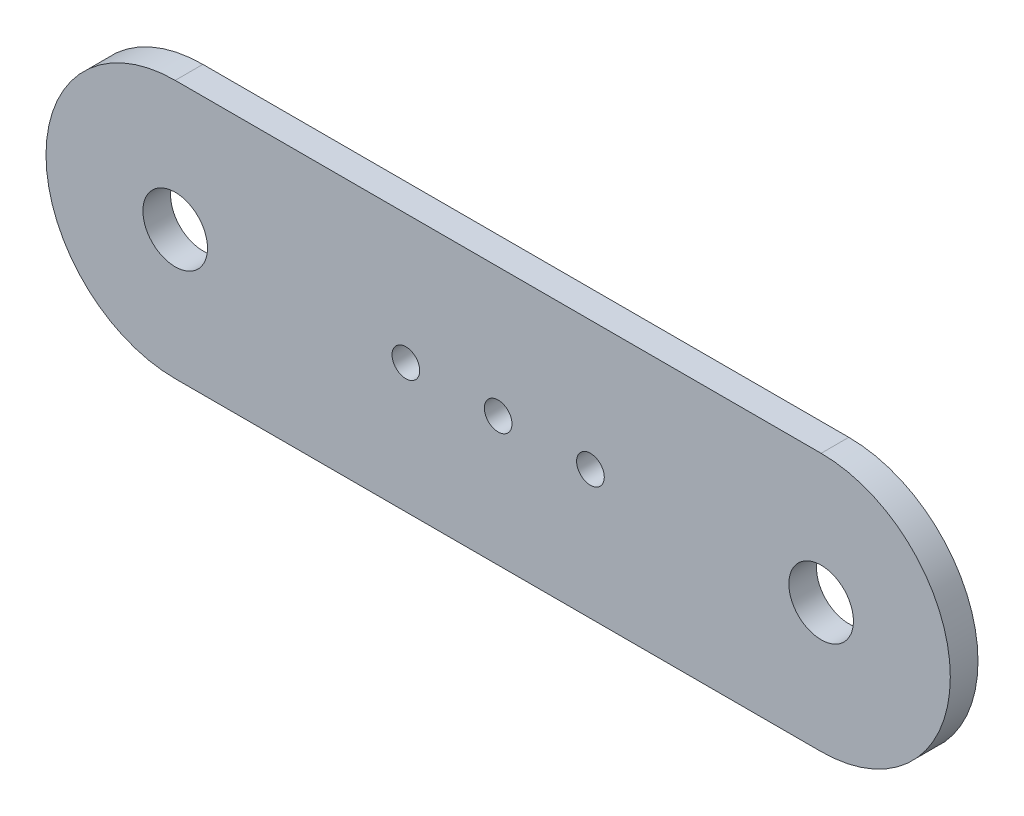
ISO-10303-21;
HEADER;
FILE_DESCRIPTION(('STEP AP214'),'2;1');
FILE_NAME('part.step','',(''),(''),'','','');
FILE_SCHEMA(('AUTOMOTIVE_DESIGN { 1 0 10303 214 1 1 1 1 }'));
ENDSEC;
DATA;
#1=APPLICATION_CONTEXT('core data for automotive mechanical design processes');
#2=APPLICATION_PROTOCOL_DEFINITION('international standard','automotive_design',2000,#1);
#3=PRODUCT_CONTEXT('',#1,'mechanical');
#4=PRODUCT('Part','Part','',(#3));
#5=PRODUCT_RELATED_PRODUCT_CATEGORY('part','',(#4));
#6=PRODUCT_DEFINITION_FORMATION('','',#4);
#7=PRODUCT_DEFINITION_CONTEXT('part definition',#1,'design');
#8=PRODUCT_DEFINITION('design','',#6,#7);
#9=PRODUCT_DEFINITION_SHAPE('','',#8);
#10=(LENGTH_UNIT() NAMED_UNIT(*) SI_UNIT(.MILLI.,.METRE.));
#11=(NAMED_UNIT(*) PLANE_ANGLE_UNIT() SI_UNIT($,.RADIAN.));
#12=(NAMED_UNIT(*) SI_UNIT($,.STERADIAN.) SOLID_ANGLE_UNIT());
#13=UNCERTAINTY_MEASURE_WITH_UNIT(LENGTH_MEASURE(1.E-05),#10,'distance_accuracy_value','');
#14=(GEOMETRIC_REPRESENTATION_CONTEXT(3) GLOBAL_UNCERTAINTY_ASSIGNED_CONTEXT((#13)) GLOBAL_UNIT_ASSIGNED_CONTEXT((#10,
#11,#12)) REPRESENTATION_CONTEXT('',''));
#15=CARTESIAN_POINT('',(0.,0.,0.));
#16=DIRECTION('',(0.,0.,1.));
#17=DIRECTION('',(1.,0.,0.));
#18=AXIS2_PLACEMENT_3D('',#15,#16,#17);
#19=CARTESIAN_POINT('',(0.,0.,3.));
#20=DIRECTION('',(0.,0.,1.));
#21=DIRECTION('',(1.,0.,0.));
#22=AXIS2_PLACEMENT_3D('',#19,#20,#21);
#23=PLANE('',#22);
#24=CARTESIAN_POINT('',(34.9999999999983,0.,3.));
#25=DIRECTION('',(0.,0.,1.));
#26=DIRECTION('',(1.,0.,0.));
#27=AXIS2_PLACEMENT_3D('',#24,#25,#26);
#28=CIRCLE('',#27,1.5);
#29=CARTESIAN_POINT('',(36.4999999999983,0.,3.));
#30=VERTEX_POINT('',#29);
#31=EDGE_CURVE('E129',#30,#30,#28,.T.);
#32=ORIENTED_EDGE('',*,*,#31,.F.);
#33=EDGE_LOOP('',(#32));
#34=FACE_BOUND('',#33,.T.);
#35=CARTESIAN_POINT('',(25.0000000000028,0.,3.));
#36=DIRECTION('',(0.,0.,1.));
#37=DIRECTION('',(1.,0.,0.));
#38=AXIS2_PLACEMENT_3D('',#35,#36,#37);
#39=CIRCLE('',#38,1.5);
#40=CARTESIAN_POINT('',(26.5000000000028,0.,3.));
#41=VERTEX_POINT('',#40);
#42=EDGE_CURVE('E117',#41,#41,#39,.T.);
#43=ORIENTED_EDGE('',*,*,#42,.F.);
#44=EDGE_LOOP('',(#43));
#45=FACE_BOUND('',#44,.T.);
#46=CARTESIAN_POINT('',(0.,0.,3.));
#47=DIRECTION('',(0.,0.,1.));
#48=DIRECTION('',(1.,0.,0.));
#49=AXIS2_PLACEMENT_3D('',#46,#47,#48);
#50=CIRCLE('',#49,14.);
#51=CARTESIAN_POINT('',(0.,14.,3.));
#52=VERTEX_POINT('',#51);
#53=CARTESIAN_POINT('',(0.,-14.,3.));
#54=VERTEX_POINT('',#53);
#55=EDGE_CURVE('E87',#52,#54,#50,.T.);
#56=ORIENTED_EDGE('',*,*,#55,.T.);
#57=DIRECTION('',(1.,0.,0.));
#58=VECTOR('',#57,1.);
#59=CARTESIAN_POINT('',(0.,-14.,3.));
#60=LINE('',#59,#58);
#61=CARTESIAN_POINT('',(70.,-14.,3.));
#62=VERTEX_POINT('',#61);
#63=EDGE_CURVE('E82',#54,#62,#60,.T.);
#64=ORIENTED_EDGE('',*,*,#63,.T.);
#65=CARTESIAN_POINT('',(70.,0.,3.));
#66=DIRECTION('',(0.,0.,1.));
#67=DIRECTION('',(1.,0.,0.));
#68=AXIS2_PLACEMENT_3D('',#65,#66,#67);
#69=CIRCLE('',#68,14.);
#70=CARTESIAN_POINT('',(70.,14.,3.));
#71=VERTEX_POINT('',#70);
#72=EDGE_CURVE('E85',#62,#71,#69,.T.);
#73=ORIENTED_EDGE('',*,*,#72,.T.);
#74=DIRECTION('',(-1.,0.,0.));
#75=VECTOR('',#74,1.);
#76=CARTESIAN_POINT('',(0.,14.,3.));
#77=LINE('',#76,#75);
#78=EDGE_CURVE('E52',#71,#52,#77,.T.);
#79=ORIENTED_EDGE('',*,*,#78,.T.);
#80=EDGE_LOOP('',(#56,#64,#73,#79));
#81=FACE_BOUND('',#80,.T.);
#82=CARTESIAN_POINT('',(0.,0.,3.));
#83=DIRECTION('',(0.,0.,1.));
#84=DIRECTION('',(1.,0.,0.));
#85=AXIS2_PLACEMENT_3D('',#82,#83,#84);
#86=CIRCLE('',#85,3.5);
#87=CARTESIAN_POINT('',(3.5,0.,3.));
#88=VERTEX_POINT('',#87);
#89=EDGE_CURVE('E102',#88,#88,#86,.T.);
#90=ORIENTED_EDGE('',*,*,#89,.F.);
#91=EDGE_LOOP('',(#90));
#92=FACE_BOUND('',#91,.T.);
#93=CARTESIAN_POINT('',(70.,0.,3.));
#94=DIRECTION('',(0.,0.,1.));
#95=DIRECTION('',(1.,0.,0.));
#96=AXIS2_PLACEMENT_3D('',#93,#94,#95);
#97=CIRCLE('',#96,3.50000000000001);
#98=CARTESIAN_POINT('',(73.5,0.,3.));
#99=VERTEX_POINT('',#98);
#100=EDGE_CURVE('E123',#99,#99,#97,.T.);
#101=ORIENTED_EDGE('',*,*,#100,.F.);
#102=EDGE_LOOP('',(#101));
#103=FACE_BOUND('',#102,.T.);
#104=CARTESIAN_POINT('',(44.9999999999938,0.,3.));
#105=DIRECTION('',(0.,0.,1.));
#106=DIRECTION('',(1.,0.,0.));
#107=AXIS2_PLACEMENT_3D('',#104,#105,#106);
#108=CIRCLE('',#107,1.5);
#109=CARTESIAN_POINT('',(46.4999999999938,0.,3.));
#110=VERTEX_POINT('',#109);
#111=EDGE_CURVE('E135',#110,#110,#108,.T.);
#112=ORIENTED_EDGE('',*,*,#111,.F.);
#113=EDGE_LOOP('',(#112));
#114=FACE_BOUND('',#113,.T.);
#115=ADVANCED_FACE('F35',(#34,#45,#81,#92,#103,#114),#23,.T.);
#116=CARTESIAN_POINT('',(0.,0.,0.));
#117=DIRECTION('',(0.,0.,1.));
#118=DIRECTION('',(1.,0.,0.));
#119=AXIS2_PLACEMENT_3D('',#116,#117,#118);
#120=PLANE('',#119);
#121=CARTESIAN_POINT('',(34.9999999999983,0.,0.));
#122=DIRECTION('',(0.,0.,1.));
#123=DIRECTION('',(1.,0.,0.));
#124=AXIS2_PLACEMENT_3D('',#121,#122,#123);
#125=CIRCLE('',#124,1.5);
#126=CARTESIAN_POINT('',(36.4999999999983,0.,0.));
#127=VERTEX_POINT('',#126);
#128=EDGE_CURVE('E132',#127,#127,#125,.T.);
#129=ORIENTED_EDGE('',*,*,#128,.T.);
#130=EDGE_LOOP('',(#129));
#131=FACE_BOUND('',#130,.T.);
#132=CARTESIAN_POINT('',(25.0000000000028,0.,0.));
#133=DIRECTION('',(0.,0.,1.));
#134=DIRECTION('',(1.,0.,0.));
#135=AXIS2_PLACEMENT_3D('',#132,#133,#134);
#136=CIRCLE('',#135,1.5);
#137=CARTESIAN_POINT('',(26.5000000000028,0.,0.));
#138=VERTEX_POINT('',#137);
#139=EDGE_CURVE('E120',#138,#138,#136,.T.);
#140=ORIENTED_EDGE('',*,*,#139,.T.);
#141=EDGE_LOOP('',(#140));
#142=FACE_BOUND('',#141,.T.);
#143=CARTESIAN_POINT('',(0.,0.,0.));
#144=DIRECTION('',(0.,0.,1.));
#145=DIRECTION('',(1.,0.,0.));
#146=AXIS2_PLACEMENT_3D('',#143,#144,#145);
#147=CIRCLE('',#146,14.);
#148=CARTESIAN_POINT('',(0.,14.,0.));
#149=VERTEX_POINT('',#148);
#150=CARTESIAN_POINT('',(0.,-14.,0.));
#151=VERTEX_POINT('',#150);
#152=EDGE_CURVE('E99',#149,#151,#147,.T.);
#153=ORIENTED_EDGE('',*,*,#152,.F.);
#154=DIRECTION('',(-1.,0.,0.));
#155=VECTOR('',#154,1.);
#156=CARTESIAN_POINT('',(0.,14.,0.));
#157=LINE('',#156,#155);
#158=CARTESIAN_POINT('',(70.,14.,0.));
#159=VERTEX_POINT('',#158);
#160=EDGE_CURVE('E75',#159,#149,#157,.T.);
#161=ORIENTED_EDGE('',*,*,#160,.F.);
#162=CARTESIAN_POINT('',(70.,0.,0.));
#163=DIRECTION('',(0.,0.,1.));
#164=DIRECTION('',(1.,0.,0.));
#165=AXIS2_PLACEMENT_3D('',#162,#163,#164);
#166=CIRCLE('',#165,14.);
#167=CARTESIAN_POINT('',(70.,-14.,0.));
#168=VERTEX_POINT('',#167);
#169=EDGE_CURVE('E69',#168,#159,#166,.T.);
#170=ORIENTED_EDGE('',*,*,#169,.F.);
#171=DIRECTION('',(1.,0.,0.));
#172=VECTOR('',#171,1.);
#173=CARTESIAN_POINT('',(0.,-14.,0.));
#174=LINE('',#173,#172);
#175=EDGE_CURVE('E91',#151,#168,#174,.T.);
#176=ORIENTED_EDGE('',*,*,#175,.F.);
#177=EDGE_LOOP('',(#153,#161,#170,#176));
#178=FACE_BOUND('',#177,.T.);
#179=CARTESIAN_POINT('',(0.,0.,0.));
#180=DIRECTION('',(0.,0.,1.));
#181=DIRECTION('',(1.,0.,0.));
#182=AXIS2_PLACEMENT_3D('',#179,#180,#181);
#183=CIRCLE('',#182,3.5);
#184=CARTESIAN_POINT('',(3.5,0.,0.));
#185=VERTEX_POINT('',#184);
#186=EDGE_CURVE('E114',#185,#185,#183,.T.);
#187=ORIENTED_EDGE('',*,*,#186,.T.);
#188=EDGE_LOOP('',(#187));
#189=FACE_BOUND('',#188,.T.);
#190=CARTESIAN_POINT('',(70.,0.,0.));
#191=DIRECTION('',(0.,0.,1.));
#192=DIRECTION('',(1.,0.,0.));
#193=AXIS2_PLACEMENT_3D('',#190,#191,#192);
#194=CIRCLE('',#193,3.50000000000001);
#195=CARTESIAN_POINT('',(73.5,0.,0.));
#196=VERTEX_POINT('',#195);
#197=EDGE_CURVE('E126',#196,#196,#194,.T.);
#198=ORIENTED_EDGE('',*,*,#197,.T.);
#199=EDGE_LOOP('',(#198));
#200=FACE_BOUND('',#199,.T.);
#201=CARTESIAN_POINT('',(44.9999999999938,0.,0.));
#202=DIRECTION('',(0.,0.,1.));
#203=DIRECTION('',(1.,0.,0.));
#204=AXIS2_PLACEMENT_3D('',#201,#202,#203);
#205=CIRCLE('',#204,1.5);
#206=CARTESIAN_POINT('',(46.4999999999938,0.,0.));
#207=VERTEX_POINT('',#206);
#208=EDGE_CURVE('E138',#207,#207,#205,.T.);
#209=ORIENTED_EDGE('',*,*,#208,.T.);
#210=EDGE_LOOP('',(#209));
#211=FACE_BOUND('',#210,.T.);
#212=ADVANCED_FACE('F110',(#131,#142,#178,#189,#200,#211),#120,.F.);
#213=CARTESIAN_POINT('',(0.,0.,3.));
#214=DIRECTION('',(0.,0.,-1.));
#215=DIRECTION('',(-1.,0.,0.));
#216=AXIS2_PLACEMENT_3D('',#213,#214,#215);
#217=CYLINDRICAL_SURFACE('',#216,14.);
#218=ORIENTED_EDGE('',*,*,#152,.T.);
#219=DIRECTION('',(0.,0.,-1.));
#220=VECTOR('',#219,1.);
#221=CARTESIAN_POINT('',(0.,-14.,3.));
#222=LINE('',#221,#220);
#223=EDGE_CURVE('E11',#54,#151,#222,.T.);
#224=ORIENTED_EDGE('',*,*,#223,.F.);
#225=ORIENTED_EDGE('',*,*,#55,.F.);
#226=DIRECTION('',(0.,0.,-1.));
#227=VECTOR('',#226,1.);
#228=CARTESIAN_POINT('',(0.,14.,3.));
#229=LINE('',#228,#227);
#230=EDGE_CURVE('E95',#52,#149,#229,.T.);
#231=ORIENTED_EDGE('',*,*,#230,.T.);
#232=EDGE_LOOP('',(#218,#224,#225,#231));
#233=FACE_BOUND('',#232,.T.);
#234=ADVANCED_FACE('F37',(#233),#217,.T.);
#235=CARTESIAN_POINT('',(0.,-14.,3.));
#236=DIRECTION('',(0.,1.,0.));
#237=DIRECTION('',(0.,0.,1.));
#238=AXIS2_PLACEMENT_3D('',#235,#236,#237);
#239=PLANE('',#238);
#240=ORIENTED_EDGE('',*,*,#175,.T.);
#241=DIRECTION('',(0.,0.,-1.));
#242=VECTOR('',#241,1.);
#243=CARTESIAN_POINT('',(70.,-14.,3.));
#244=LINE('',#243,#242);
#245=EDGE_CURVE('E44',#62,#168,#244,.T.);
#246=ORIENTED_EDGE('',*,*,#245,.F.);
#247=ORIENTED_EDGE('',*,*,#63,.F.);
#248=ORIENTED_EDGE('',*,*,#223,.T.);
#249=EDGE_LOOP('',(#240,#246,#247,#248));
#250=FACE_BOUND('',#249,.T.);
#251=ADVANCED_FACE('F90',(#250),#239,.F.);
#252=CARTESIAN_POINT('',(70.,0.,3.));
#253=DIRECTION('',(0.,0.,-1.));
#254=DIRECTION('',(-1.,0.,0.));
#255=AXIS2_PLACEMENT_3D('',#252,#253,#254);
#256=CYLINDRICAL_SURFACE('',#255,14.);
#257=ORIENTED_EDGE('',*,*,#169,.T.);
#258=DIRECTION('',(0.,0.,-1.));
#259=VECTOR('',#258,1.);
#260=CARTESIAN_POINT('',(70.,14.,3.));
#261=LINE('',#260,#259);
#262=EDGE_CURVE('E92',#71,#159,#261,.T.);
#263=ORIENTED_EDGE('',*,*,#262,.F.);
#264=ORIENTED_EDGE('',*,*,#72,.F.);
#265=ORIENTED_EDGE('',*,*,#245,.T.);
#266=EDGE_LOOP('',(#257,#263,#264,#265));
#267=FACE_BOUND('',#266,.T.);
#268=ADVANCED_FACE('F93',(#267),#256,.T.);
#269=CARTESIAN_POINT('',(0.,14.,3.));
#270=DIRECTION('',(0.,-1.,0.));
#271=DIRECTION('',(0.,0.,-1.));
#272=AXIS2_PLACEMENT_3D('',#269,#270,#271);
#273=PLANE('',#272);
#274=ORIENTED_EDGE('',*,*,#160,.T.);
#275=ORIENTED_EDGE('',*,*,#230,.F.);
#276=ORIENTED_EDGE('',*,*,#78,.F.);
#277=ORIENTED_EDGE('',*,*,#262,.T.);
#278=EDGE_LOOP('',(#274,#275,#276,#277));
#279=FACE_BOUND('',#278,.T.);
#280=ADVANCED_FACE('F107',(#279),#273,.F.);
#281=CARTESIAN_POINT('',(0.,0.,3.));
#282=DIRECTION('',(0.,0.,-1.));
#283=DIRECTION('',(-1.,0.,0.));
#284=AXIS2_PLACEMENT_3D('',#281,#282,#283);
#285=CYLINDRICAL_SURFACE('',#284,3.5);
#286=ORIENTED_EDGE('',*,*,#89,.T.);
#287=EDGE_LOOP('',(#286));
#288=FACE_BOUND('',#287,.T.);
#289=ORIENTED_EDGE('',*,*,#186,.F.);
#290=EDGE_LOOP('',(#289));
#291=FACE_BOUND('',#290,.T.);
#292=ADVANCED_FACE('F158',(#288,#291),#285,.F.);
#293=CARTESIAN_POINT('',(25.0000000000028,0.,3.));
#294=DIRECTION('',(0.,0.,-1.));
#295=DIRECTION('',(-1.,0.,0.));
#296=AXIS2_PLACEMENT_3D('',#293,#294,#295);
#297=CYLINDRICAL_SURFACE('',#296,1.5);
#298=ORIENTED_EDGE('',*,*,#42,.T.);
#299=EDGE_LOOP('',(#298));
#300=FACE_BOUND('',#299,.T.);
#301=ORIENTED_EDGE('',*,*,#139,.F.);
#302=EDGE_LOOP('',(#301));
#303=FACE_BOUND('',#302,.T.);
#304=ADVANCED_FACE('F204',(#300,#303),#297,.F.);
#305=CARTESIAN_POINT('',(70.,0.,3.));
#306=DIRECTION('',(0.,0.,-1.));
#307=DIRECTION('',(-1.,0.,0.));
#308=AXIS2_PLACEMENT_3D('',#305,#306,#307);
#309=CYLINDRICAL_SURFACE('',#308,3.50000000000001);
#310=ORIENTED_EDGE('',*,*,#100,.T.);
#311=EDGE_LOOP('',(#310));
#312=FACE_BOUND('',#311,.T.);
#313=ORIENTED_EDGE('',*,*,#197,.F.);
#314=EDGE_LOOP('',(#313));
#315=FACE_BOUND('',#314,.T.);
#316=ADVANCED_FACE('F212',(#312,#315),#309,.F.);
#317=CARTESIAN_POINT('',(34.9999999999983,0.,3.));
#318=DIRECTION('',(0.,0.,-1.));
#319=DIRECTION('',(-1.,0.,0.));
#320=AXIS2_PLACEMENT_3D('',#317,#318,#319);
#321=CYLINDRICAL_SURFACE('',#320,1.5);
#322=ORIENTED_EDGE('',*,*,#31,.T.);
#323=EDGE_LOOP('',(#322));
#324=FACE_BOUND('',#323,.T.);
#325=ORIENTED_EDGE('',*,*,#128,.F.);
#326=EDGE_LOOP('',(#325));
#327=FACE_BOUND('',#326,.T.);
#328=ADVANCED_FACE('F220',(#324,#327),#321,.F.);
#329=CARTESIAN_POINT('',(44.9999999999938,0.,3.));
#330=DIRECTION('',(0.,0.,-1.));
#331=DIRECTION('',(-1.,0.,0.));
#332=AXIS2_PLACEMENT_3D('',#329,#330,#331);
#333=CYLINDRICAL_SURFACE('',#332,1.5);
#334=ORIENTED_EDGE('',*,*,#111,.T.);
#335=EDGE_LOOP('',(#334));
#336=FACE_BOUND('',#335,.T.);
#337=ORIENTED_EDGE('',*,*,#208,.F.);
#338=EDGE_LOOP('',(#337));
#339=FACE_BOUND('',#338,.T.);
#340=ADVANCED_FACE('F144',(#336,#339),#333,.F.);
#341=CLOSED_SHELL('',(#115,#212,#234,#251,#268,#280,#292,#304,#316,#328,#340));
#342=MANIFOLD_SOLID_BREP('B2',#341);
#343=ADVANCED_BREP_SHAPE_REPRESENTATION('',(#18,#342),#14);
#344=SHAPE_DEFINITION_REPRESENTATION(#9,#343);
ENDSEC;
END-ISO-10303-21;
